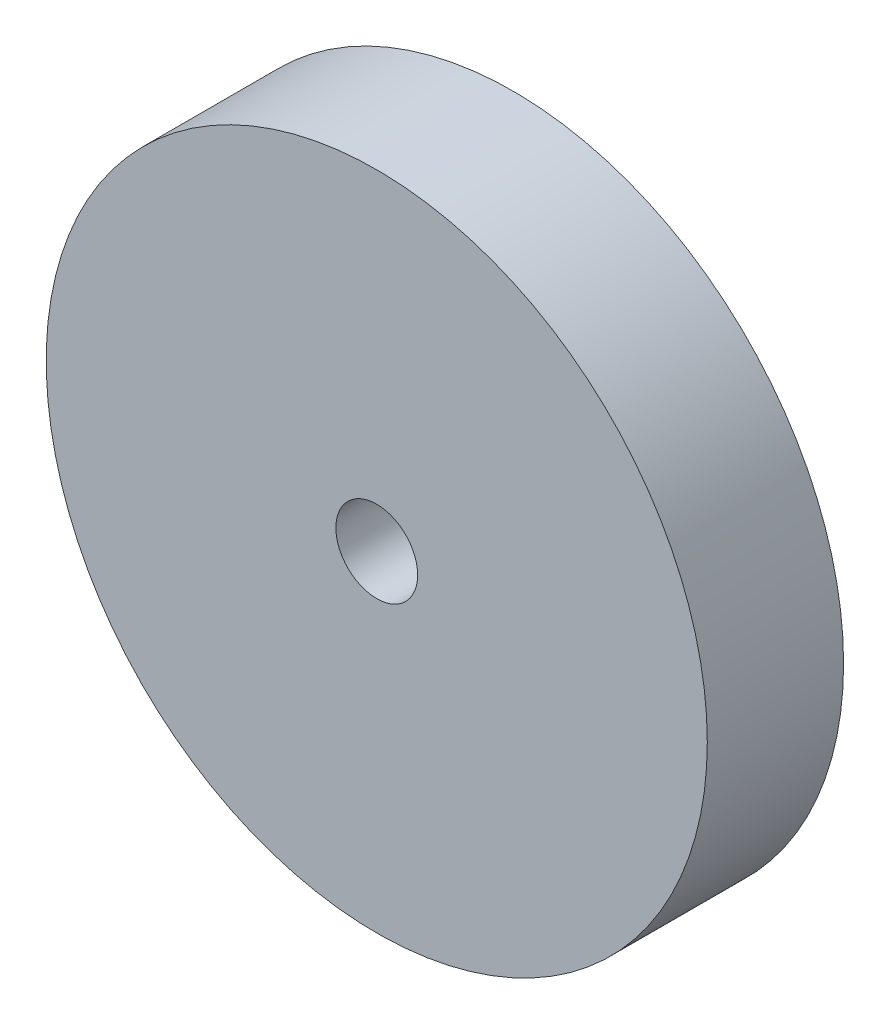
ISO-10303-21;
HEADER;
FILE_DESCRIPTION(('STEP AP214'),'2;1');
FILE_NAME('part.step','',(''),(''),'','','');
FILE_SCHEMA(('AUTOMOTIVE_DESIGN { 1 0 10303 214 1 1 1 1 }'));
ENDSEC;
DATA;
#1=APPLICATION_CONTEXT('core data for automotive mechanical design processes');
#2=APPLICATION_PROTOCOL_DEFINITION('international standard','automotive_design',2000,#1);
#3=PRODUCT_CONTEXT('',#1,'mechanical');
#4=PRODUCT('Part','Part','',(#3));
#5=PRODUCT_RELATED_PRODUCT_CATEGORY('part','',(#4));
#6=PRODUCT_DEFINITION_FORMATION('','',#4);
#7=PRODUCT_DEFINITION_CONTEXT('part definition',#1,'design');
#8=PRODUCT_DEFINITION('design','',#6,#7);
#9=PRODUCT_DEFINITION_SHAPE('','',#8);
#10=(LENGTH_UNIT() NAMED_UNIT(*) SI_UNIT(.MILLI.,.METRE.));
#11=(NAMED_UNIT(*) PLANE_ANGLE_UNIT() SI_UNIT($,.RADIAN.));
#12=(NAMED_UNIT(*) SI_UNIT($,.STERADIAN.) SOLID_ANGLE_UNIT());
#13=UNCERTAINTY_MEASURE_WITH_UNIT(LENGTH_MEASURE(1.E-05),#10,'distance_accuracy_value','');
#14=(GEOMETRIC_REPRESENTATION_CONTEXT(3) GLOBAL_UNCERTAINTY_ASSIGNED_CONTEXT((#13)) GLOBAL_UNIT_ASSIGNED_CONTEXT((#10,
#11,#12)) REPRESENTATION_CONTEXT('',''));
#15=CARTESIAN_POINT('',(0.,0.,0.));
#16=DIRECTION('',(0.,0.,1.));
#17=DIRECTION('',(1.,0.,0.));
#18=AXIS2_PLACEMENT_3D('',#15,#16,#17);
#19=CARTESIAN_POINT('',(0.,0.,20.));
#20=DIRECTION('',(0.,0.,1.));
#21=DIRECTION('',(1.,0.,0.));
#22=AXIS2_PLACEMENT_3D('',#19,#20,#21);
#23=PLANE('',#22);
#24=CARTESIAN_POINT('',(0.,0.,20.));
#25=DIRECTION('',(0.,0.,1.));
#26=DIRECTION('',(1.,0.,0.));
#27=AXIS2_PLACEMENT_3D('',#24,#25,#26);
#28=CIRCLE('',#27,48.5);
#29=CARTESIAN_POINT('',(48.5,0.,20.));
#30=VERTEX_POINT('',#29);
#31=EDGE_CURVE('E10',#30,#30,#28,.T.);
#32=ORIENTED_EDGE('',*,*,#31,.T.);
#33=EDGE_LOOP('',(#32));
#34=FACE_BOUND('',#33,.T.);
#35=CARTESIAN_POINT('',(0.,0.,20.));
#36=DIRECTION('',(0.,0.,1.));
#37=DIRECTION('',(1.,0.,0.));
#38=AXIS2_PLACEMENT_3D('',#35,#36,#37);
#39=CIRCLE('',#38,6.);
#40=CARTESIAN_POINT('',(6.,0.,20.));
#41=VERTEX_POINT('',#40);
#42=EDGE_CURVE('E42',#41,#41,#39,.T.);
#43=ORIENTED_EDGE('',*,*,#42,.F.);
#44=EDGE_LOOP('',(#43));
#45=FACE_BOUND('',#44,.T.);
#46=ADVANCED_FACE('F31',(#34,#45),#23,.T.);
#47=CARTESIAN_POINT('',(0.,0.,0.));
#48=DIRECTION('',(0.,0.,1.));
#49=DIRECTION('',(1.,0.,0.));
#50=AXIS2_PLACEMENT_3D('',#47,#48,#49);
#51=PLANE('',#50);
#52=CARTESIAN_POINT('',(0.,0.,0.));
#53=DIRECTION('',(0.,0.,1.));
#54=DIRECTION('',(1.,0.,0.));
#55=AXIS2_PLACEMENT_3D('',#52,#53,#54);
#56=CIRCLE('',#55,48.5);
#57=CARTESIAN_POINT('',(48.5,0.,0.));
#58=VERTEX_POINT('',#57);
#59=EDGE_CURVE('E35',#58,#58,#56,.T.);
#60=ORIENTED_EDGE('',*,*,#59,.F.);
#61=EDGE_LOOP('',(#60));
#62=FACE_BOUND('',#61,.T.);
#63=CARTESIAN_POINT('',(0.,0.,0.));
#64=DIRECTION('',(0.,0.,1.));
#65=DIRECTION('',(1.,0.,0.));
#66=AXIS2_PLACEMENT_3D('',#63,#64,#65);
#67=CIRCLE('',#66,6.);
#68=CARTESIAN_POINT('',(6.,0.,0.));
#69=VERTEX_POINT('',#68);
#70=EDGE_CURVE('E44',#69,#69,#67,.T.);
#71=ORIENTED_EDGE('',*,*,#70,.T.);
#72=EDGE_LOOP('',(#71));
#73=FACE_BOUND('',#72,.T.);
#74=ADVANCED_FACE('F54',(#62,#73),#51,.F.);
#75=CARTESIAN_POINT('',(0.,0.,20.));
#76=DIRECTION('',(0.,0.,-1.));
#77=DIRECTION('',(-1.,0.,0.));
#78=AXIS2_PLACEMENT_3D('',#75,#76,#77);
#79=CYLINDRICAL_SURFACE('',#78,48.5);
#80=ORIENTED_EDGE('',*,*,#31,.F.);
#81=EDGE_LOOP('',(#80));
#82=FACE_BOUND('',#81,.T.);
#83=ORIENTED_EDGE('',*,*,#59,.T.);
#84=EDGE_LOOP('',(#83));
#85=FACE_BOUND('',#84,.T.);
#86=ADVANCED_FACE('F33',(#82,#85),#79,.T.);
#87=CARTESIAN_POINT('',(0.,0.,20.));
#88=DIRECTION('',(0.,0.,-1.));
#89=DIRECTION('',(-1.,0.,0.));
#90=AXIS2_PLACEMENT_3D('',#87,#88,#89);
#91=CYLINDRICAL_SURFACE('',#90,6.);
#92=ORIENTED_EDGE('',*,*,#42,.T.);
#93=EDGE_LOOP('',(#92));
#94=FACE_BOUND('',#93,.T.);
#95=ORIENTED_EDGE('',*,*,#70,.F.);
#96=EDGE_LOOP('',(#95));
#97=FACE_BOUND('',#96,.T.);
#98=ADVANCED_FACE('F50',(#94,#97),#91,.F.);
#99=CLOSED_SHELL('',(#46,#74,#86,#98));
#100=MANIFOLD_SOLID_BREP('B2',#99);
#101=ADVANCED_BREP_SHAPE_REPRESENTATION('',(#18,#100),#14);
#102=SHAPE_DEFINITION_REPRESENTATION(#9,#101);
ENDSEC;
END-ISO-10303-21;
